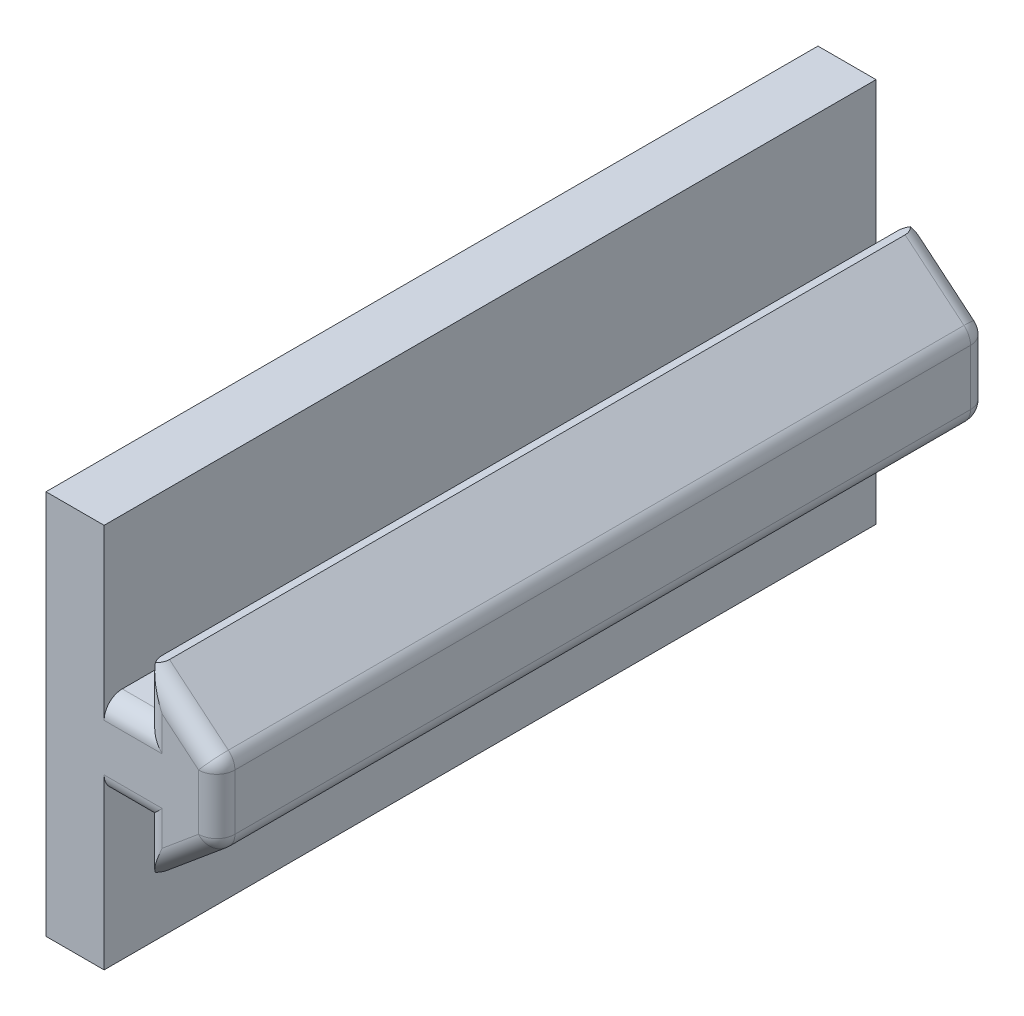
ISO-10303-21;
HEADER;
FILE_DESCRIPTION(('STEP AP214'),'2;1');
FILE_NAME('part.step','',(''),(''),'','','');
FILE_SCHEMA(('AUTOMOTIVE_DESIGN { 1 0 10303 214 1 1 1 1 }'));
ENDSEC;
DATA;
#1=APPLICATION_CONTEXT('core data for automotive mechanical design processes');
#2=APPLICATION_PROTOCOL_DEFINITION('international standard','automotive_design',2000,#1);
#3=PRODUCT_CONTEXT('',#1,'mechanical');
#4=PRODUCT('Part','Part','',(#3));
#5=PRODUCT_RELATED_PRODUCT_CATEGORY('part','',(#4));
#6=PRODUCT_DEFINITION_FORMATION('','',#4);
#7=PRODUCT_DEFINITION_CONTEXT('part definition',#1,'design');
#8=PRODUCT_DEFINITION('design','',#6,#7);
#9=PRODUCT_DEFINITION_SHAPE('','',#8);
#10=(LENGTH_UNIT() NAMED_UNIT(*) SI_UNIT(.MILLI.,.METRE.));
#11=(NAMED_UNIT(*) PLANE_ANGLE_UNIT() SI_UNIT($,.RADIAN.));
#12=(NAMED_UNIT(*) SI_UNIT($,.STERADIAN.) SOLID_ANGLE_UNIT());
#13=UNCERTAINTY_MEASURE_WITH_UNIT(LENGTH_MEASURE(1.E-05),#10,'distance_accuracy_value','');
#14=(GEOMETRIC_REPRESENTATION_CONTEXT(3) GLOBAL_UNCERTAINTY_ASSIGNED_CONTEXT((#13)) GLOBAL_UNIT_ASSIGNED_CONTEXT((#10,
#11,#12)) REPRESENTATION_CONTEXT('',''));
#15=CARTESIAN_POINT('',(0.,0.,0.));
#16=DIRECTION('',(0.,0.,1.));
#17=DIRECTION('',(1.,0.,0.));
#18=AXIS2_PLACEMENT_3D('',#15,#16,#17);
#19=CARTESIAN_POINT('',(7.874,2.54,-26.9875));
#20=DIRECTION('',(0.64018439966448,0.768221279597376,0.));
#21=DIRECTION('',(-0.768221279597376,0.64018439966448,0.));
#22=AXIS2_PLACEMENT_3D('',#19,#20,#21);
#23=PLANE('',#22);
#24=DIRECTION('',(0.,0.,1.));
#25=VECTOR('',#24,1.);
#26=CARTESIAN_POINT('',(3.302,6.35,-26.9875));
#27=LINE('',#26,#25);
#28=CARTESIAN_POINT('',(3.302,6.35,-25.7175));
#29=VERTEX_POINT('',#28);
#30=CARTESIAN_POINT('',(3.302,6.35,25.7175));
#31=VERTEX_POINT('',#30);
#32=EDGE_CURVE('E298',#29,#31,#27,.T.);
#33=ORIENTED_EDGE('',*,*,#32,.T.);
#34=DIRECTION('',(-0.768221279597376,0.64018439966448,0.));
#35=VECTOR('',#34,1.);
#36=CARTESIAN_POINT('',(7.41703418757389,2.92080484368842,25.7175));
#37=LINE('',#36,#35);
#38=CARTESIAN_POINT('',(7.41703418757389,2.92080484368843,25.7175));
#39=VERTEX_POINT('',#38);
#40=EDGE_CURVE('E465',#31,#39,#37,.F.);
#41=ORIENTED_EDGE('',*,*,#40,.T.);
#42=DIRECTION('',(0.,0.,1.));
#43=VECTOR('',#42,1.);
#44=CARTESIAN_POINT('',(7.41703418757389,2.92080484368843,-26.9875));
#45=LINE('',#44,#43);
#46=CARTESIAN_POINT('',(7.41703418757389,2.92080484368843,-25.7175));
#47=VERTEX_POINT('',#46);
#48=EDGE_CURVE('E322',#39,#47,#45,.F.);
#49=ORIENTED_EDGE('',*,*,#48,.T.);
#50=DIRECTION('',(-0.768221279597376,0.64018439966448,0.));
#51=VECTOR('',#50,1.);
#52=CARTESIAN_POINT('',(7.874,2.54,-25.7175));
#53=LINE('',#52,#51);
#54=EDGE_CURVE('E361',#47,#29,#53,.T.);
#55=ORIENTED_EDGE('',*,*,#54,.T.);
#56=EDGE_LOOP('',(#33,#41,#49,#55));
#57=FACE_BOUND('',#56,.T.);
#58=ADVANCED_FACE('F41',(#57),#23,.T.);
#59=CARTESIAN_POINT('',(7.874,-2.54,-26.9875));
#60=DIRECTION('',(1.,0.,0.));
#61=DIRECTION('',(0.,0.,-1.));
#62=AXIS2_PLACEMENT_3D('',#59,#60,#61);
#63=PLANE('',#62);
#64=DIRECTION('',(0.,0.,1.));
#65=VECTOR('',#64,1.);
#66=CARTESIAN_POINT('',(7.874,1.94516381859976,-26.9875));
#67=LINE('',#66,#65);
#68=CARTESIAN_POINT('',(7.874,1.94516381859976,-25.7175));
#69=VERTEX_POINT('',#68);
#70=CARTESIAN_POINT('',(7.874,1.94516381859976,25.7175));
#71=VERTEX_POINT('',#70);
#72=EDGE_CURVE('E315',#69,#71,#67,.T.);
#73=ORIENTED_EDGE('',*,*,#72,.T.);
#74=DIRECTION('',(0.,1.,0.));
#75=VECTOR('',#74,1.);
#76=CARTESIAN_POINT('',(7.874,-1.94516381859976,25.7175));
#77=LINE('',#76,#75);
#78=CARTESIAN_POINT('',(7.874,-1.94516381859976,25.7175));
#79=VERTEX_POINT('',#78);
#80=EDGE_CURVE('E481',#71,#79,#77,.F.);
#81=ORIENTED_EDGE('',*,*,#80,.T.);
#82=DIRECTION('',(0.,0.,1.));
#83=VECTOR('',#82,1.);
#84=CARTESIAN_POINT('',(7.874,-1.94516381859976,-26.9875));
#85=LINE('',#84,#83);
#86=CARTESIAN_POINT('',(7.874,-1.94516381859976,-25.7175));
#87=VERTEX_POINT('',#86);
#88=EDGE_CURVE('E319',#79,#87,#85,.F.);
#89=ORIENTED_EDGE('',*,*,#88,.T.);
#90=DIRECTION('',(0.,1.,0.));
#91=VECTOR('',#90,1.);
#92=CARTESIAN_POINT('',(7.874,-2.54,-25.7175));
#93=LINE('',#92,#91);
#94=EDGE_CURVE('E386',#87,#69,#93,.T.);
#95=ORIENTED_EDGE('',*,*,#94,.T.);
#96=EDGE_LOOP('',(#73,#81,#89,#95));
#97=FACE_BOUND('',#96,.T.);
#98=ADVANCED_FACE('F585',(#97),#63,.T.);
#99=CARTESIAN_POINT('',(3.302,-6.35,-26.9875));
#100=DIRECTION('',(0.64018439966448,-0.768221279597376,0.));
#101=DIRECTION('',(0.768221279597376,0.64018439966448,0.));
#102=AXIS2_PLACEMENT_3D('',#99,#100,#101);
#103=PLANE('',#102);
#104=DIRECTION('',(0.,0.,1.));
#105=VECTOR('',#104,1.);
#106=CARTESIAN_POINT('',(7.41703418757389,-2.92080484368842,-26.9875));
#107=LINE('',#106,#105);
#108=CARTESIAN_POINT('',(7.41703418757389,-2.92080484368842,-25.7175));
#109=VERTEX_POINT('',#108);
#110=CARTESIAN_POINT('',(7.41703418757389,-2.92080484368842,25.7175));
#111=VERTEX_POINT('',#110);
#112=EDGE_CURVE('E311',#109,#111,#107,.T.);
#113=ORIENTED_EDGE('',*,*,#112,.T.);
#114=DIRECTION('',(0.768221279597376,0.64018439966448,0.));
#115=VECTOR('',#114,1.);
#116=CARTESIAN_POINT('',(3.302,-6.35,25.7175));
#117=LINE('',#116,#115);
#118=CARTESIAN_POINT('',(3.302,-6.35,25.7175));
#119=VERTEX_POINT('',#118);
#120=EDGE_CURVE('E447',#111,#119,#117,.F.);
#121=ORIENTED_EDGE('',*,*,#120,.T.);
#122=DIRECTION('',(0.,0.,1.));
#123=VECTOR('',#122,1.);
#124=CARTESIAN_POINT('',(3.302,-6.35,-26.9875));
#125=LINE('',#124,#123);
#126=CARTESIAN_POINT('',(3.302,-6.35,-25.7175));
#127=VERTEX_POINT('',#126);
#128=EDGE_CURVE('E301',#127,#119,#125,.T.);
#129=ORIENTED_EDGE('',*,*,#128,.F.);
#130=DIRECTION('',(0.768221279597376,0.64018439966448,0.));
#131=VECTOR('',#130,1.);
#132=CARTESIAN_POINT('',(3.302,-6.35,-25.7175));
#133=LINE('',#132,#131);
#134=EDGE_CURVE('E325',#127,#109,#133,.T.);
#135=ORIENTED_EDGE('',*,*,#134,.T.);
#136=EDGE_LOOP('',(#113,#121,#129,#135));
#137=FACE_BOUND('',#136,.T.);
#138=ADVANCED_FACE('F640',(#137),#103,.T.);
#139=CARTESIAN_POINT('',(-4.064,-6.35,-26.9875));
#140=DIRECTION('',(0.,-1.,0.));
#141=DIRECTION('',(1.,0.,0.));
#142=AXIS2_PLACEMENT_3D('',#139,#140,#141);
#143=PLANE('',#142);
#144=ORIENTED_EDGE('',*,*,#128,.T.);
#145=CARTESIAN_POINT('',(1.31819658231971,-6.35,25.7175));
#146=DIRECTION('',(0.,-1.,0.));
#147=DIRECTION('',(-1.,0.,0.));
#148=AXIS2_PLACEMENT_3D('',#145,#146,#147);
#149=ELLIPSE('',#148,1.98380341768029,1.27);
#150=CARTESIAN_POINT('',(2.99227872713341,-6.35,26.3989055424527));
#151=VERTEX_POINT('',#150);
#152=EDGE_CURVE('E453',#119,#151,#149,.T.);
#153=ORIENTED_EDGE('',*,*,#152,.T.);
#154=CARTESIAN_POINT('',(4.064,-6.35,25.7175));
#155=DIRECTION('',(0.,-1.,0.));
#156=DIRECTION('',(1.,0.,0.));
#157=AXIS2_PLACEMENT_3D('',#154,#155,#156);
#158=CIRCLE('',#157,1.27);
#159=CARTESIAN_POINT('',(2.794,-6.35,25.7175));
#160=VERTEX_POINT('',#159);
#161=EDGE_CURVE('E450',#151,#160,#158,.T.);
#162=ORIENTED_EDGE('',*,*,#161,.T.);
#163=DIRECTION('',(0.,0.,1.));
#164=VECTOR('',#163,1.);
#165=CARTESIAN_POINT('',(2.794,-6.35,-26.9875));
#166=LINE('',#165,#164);
#167=CARTESIAN_POINT('',(2.794,-6.35,-25.7175));
#168=VERTEX_POINT('',#167);
#169=EDGE_CURVE('E280',#168,#160,#166,.T.);
#170=ORIENTED_EDGE('',*,*,#169,.F.);
#171=CARTESIAN_POINT('',(4.064,-6.35,-25.7175));
#172=DIRECTION('',(0.,-1.,0.));
#173=DIRECTION('',(1.,0.,0.));
#174=AXIS2_PLACEMENT_3D('',#171,#172,#173);
#175=CIRCLE('',#174,1.27);
#176=CARTESIAN_POINT('',(2.99227872713341,-6.35,-26.3989055424527));
#177=VERTEX_POINT('',#176);
#178=EDGE_CURVE('E351',#168,#177,#175,.T.);
#179=ORIENTED_EDGE('',*,*,#178,.T.);
#180=CARTESIAN_POINT('',(1.31819658231971,-6.35,-25.7175));
#181=DIRECTION('',(0.,-1.,0.));
#182=DIRECTION('',(1.,0.,0.));
#183=AXIS2_PLACEMENT_3D('',#180,#181,#182);
#184=ELLIPSE('',#183,1.98380341768029,1.27);
#185=EDGE_CURVE('E354',#177,#127,#184,.T.);
#186=ORIENTED_EDGE('',*,*,#185,.T.);
#187=EDGE_LOOP('',(#144,#153,#162,#170,#179,#186));
#188=FACE_BOUND('',#187,.T.);
#189=ADVANCED_FACE('F621',(#188),#143,.T.);
#190=CARTESIAN_POINT('',(-4.064,6.35,-26.9875));
#191=DIRECTION('',(-1.,0.,0.));
#192=DIRECTION('',(0.,0.,1.));
#193=AXIS2_PLACEMENT_3D('',#190,#191,#192);
#194=PLANE('',#193);
#195=DIRECTION('',(0.,-1.,0.));
#196=VECTOR('',#195,1.);
#197=CARTESIAN_POINT('',(-4.064,6.35,-26.9875));
#198=LINE('',#197,#196);
#199=CARTESIAN_POINT('',(-4.064,13.462,-26.9875));
#200=VERTEX_POINT('',#199);
#201=CARTESIAN_POINT('',(-4.064,-13.462,-26.9875));
#202=VERTEX_POINT('',#201);
#203=EDGE_CURVE('E295',#200,#202,#198,.T.);
#204=ORIENTED_EDGE('',*,*,#203,.T.);
#205=DIRECTION('',(0.,0.,1.));
#206=VECTOR('',#205,1.);
#207=CARTESIAN_POINT('',(-4.064,-13.462,-26.9875));
#208=LINE('',#207,#206);
#209=CARTESIAN_POINT('',(-4.064,-13.462,26.9875));
#210=VERTEX_POINT('',#209);
#211=EDGE_CURVE('E231',#202,#210,#208,.T.);
#212=ORIENTED_EDGE('',*,*,#211,.T.);
#213=DIRECTION('',(0.,-1.,0.));
#214=VECTOR('',#213,1.);
#215=CARTESIAN_POINT('',(-4.064,6.35,26.9875));
#216=LINE('',#215,#214);
#217=CARTESIAN_POINT('',(-4.064,13.462,26.9875));
#218=VERTEX_POINT('',#217);
#219=EDGE_CURVE('E291',#218,#210,#216,.T.);
#220=ORIENTED_EDGE('',*,*,#219,.F.);
#221=DIRECTION('',(0.,0.,-1.));
#222=VECTOR('',#221,1.);
#223=CARTESIAN_POINT('',(-4.064,13.462,-26.9875));
#224=LINE('',#223,#222);
#225=EDGE_CURVE('E239',#218,#200,#224,.T.);
#226=ORIENTED_EDGE('',*,*,#225,.T.);
#227=EDGE_LOOP('',(#204,#212,#220,#226));
#228=FACE_BOUND('',#227,.T.);
#229=ADVANCED_FACE('F545',(#228),#194,.T.);
#230=CARTESIAN_POINT('',(3.302,6.35,-26.9875));
#231=DIRECTION('',(0.,1.,0.));
#232=DIRECTION('',(0.,0.,1.));
#233=AXIS2_PLACEMENT_3D('',#230,#231,#232);
#234=PLANE('',#233);
#235=CARTESIAN_POINT('',(4.064,6.35,25.7175));
#236=DIRECTION('',(0.,1.,0.));
#237=DIRECTION('',(0.,0.,1.));
#238=AXIS2_PLACEMENT_3D('',#235,#236,#237);
#239=CIRCLE('',#238,1.27);
#240=CARTESIAN_POINT('',(2.794,6.35,25.7175));
#241=VERTEX_POINT('',#240);
#242=CARTESIAN_POINT('',(2.99227872713341,6.35,26.3989055424527));
#243=VERTEX_POINT('',#242);
#244=EDGE_CURVE('E459',#241,#243,#239,.T.);
#245=ORIENTED_EDGE('',*,*,#244,.T.);
#246=CARTESIAN_POINT('',(1.31819658231971,6.35,25.7175));
#247=DIRECTION('',(0.,1.,0.));
#248=DIRECTION('',(1.,0.,0.));
#249=AXIS2_PLACEMENT_3D('',#246,#247,#248);
#250=ELLIPSE('',#249,1.98380341768029,1.27);
#251=EDGE_CURVE('E462',#243,#31,#250,.T.);
#252=ORIENTED_EDGE('',*,*,#251,.T.);
#253=ORIENTED_EDGE('',*,*,#32,.F.);
#254=CARTESIAN_POINT('',(1.31819658231971,6.35,-25.7175));
#255=DIRECTION('',(0.,1.,0.));
#256=DIRECTION('',(-1.,0.,0.));
#257=AXIS2_PLACEMENT_3D('',#254,#255,#256);
#258=ELLIPSE('',#257,1.98380341768029,1.27);
#259=CARTESIAN_POINT('',(2.99227872713341,6.35,-26.3989055424527));
#260=VERTEX_POINT('',#259);
#261=EDGE_CURVE('E367',#29,#260,#258,.T.);
#262=ORIENTED_EDGE('',*,*,#261,.T.);
#263=CARTESIAN_POINT('',(4.064,6.35,-25.7175));
#264=DIRECTION('',(0.,1.,0.));
#265=DIRECTION('',(0.,0.,1.));
#266=AXIS2_PLACEMENT_3D('',#263,#264,#265);
#267=CIRCLE('',#266,1.27);
#268=CARTESIAN_POINT('',(2.794,6.35,-25.7175));
#269=VERTEX_POINT('',#268);
#270=EDGE_CURVE('E364',#260,#269,#267,.T.);
#271=ORIENTED_EDGE('',*,*,#270,.T.);
#272=DIRECTION('',(0.,0.,1.));
#273=VECTOR('',#272,1.);
#274=CARTESIAN_POINT('',(2.794,6.35,-26.9875));
#275=LINE('',#274,#273);
#276=EDGE_CURVE('E287',#269,#241,#275,.T.);
#277=ORIENTED_EDGE('',*,*,#276,.T.);
#278=EDGE_LOOP('',(#245,#252,#253,#262,#271,#277));
#279=FACE_BOUND('',#278,.T.);
#280=ADVANCED_FACE('F644',(#279),#234,.T.);
#281=CARTESIAN_POINT('',(0.,0.,-26.9875));
#282=DIRECTION('',(0.,0.,-1.));
#283=DIRECTION('',(-1.,0.,0.));
#284=AXIS2_PLACEMENT_3D('',#281,#282,#283);
#285=PLANE('',#284);
#286=DIRECTION('',(-1.,0.,0.));
#287=VECTOR('',#286,1.);
#288=CARTESIAN_POINT('',(0.,-1.651,-26.9875));
#289=LINE('',#288,#287);
#290=CARTESIAN_POINT('',(4.064,-1.651,-26.9875));
#291=VERTEX_POINT('',#290);
#292=CARTESIAN_POINT('',(0.,-1.651,-26.9875));
#293=VERTEX_POINT('',#292);
#294=EDGE_CURVE('E347',#291,#293,#289,.T.);
#295=ORIENTED_EDGE('',*,*,#294,.T.);
#296=DIRECTION('',(0.,-1.,0.));
#297=VECTOR('',#296,1.);
#298=CARTESIAN_POINT('',(0.,-13.462,-26.9875));
#299=LINE('',#298,#297);
#300=CARTESIAN_POINT('',(0.,-13.462,-26.9875));
#301=VERTEX_POINT('',#300);
#302=EDGE_CURVE('E250',#293,#301,#299,.T.);
#303=ORIENTED_EDGE('',*,*,#302,.T.);
#304=DIRECTION('',(-1.,0.,0.));
#305=VECTOR('',#304,1.);
#306=CARTESIAN_POINT('',(0.,-13.462,-26.9875));
#307=LINE('',#306,#305);
#308=EDGE_CURVE('E271',#301,#202,#307,.T.);
#309=ORIENTED_EDGE('',*,*,#308,.T.);
#310=ORIENTED_EDGE('',*,*,#203,.F.);
#311=DIRECTION('',(-1.,0.,0.));
#312=VECTOR('',#311,1.);
#313=CARTESIAN_POINT('',(0.,13.462,-26.9875));
#314=LINE('',#313,#312);
#315=CARTESIAN_POINT('',(0.,13.462,-26.9875));
#316=VERTEX_POINT('',#315);
#317=EDGE_CURVE('E241',#316,#200,#314,.T.);
#318=ORIENTED_EDGE('',*,*,#317,.F.);
#319=CARTESIAN_POINT('',(0.,1.651,-26.9875));
#320=VERTEX_POINT('',#319);
#321=EDGE_CURVE('E248',#316,#320,#299,.T.);
#322=ORIENTED_EDGE('',*,*,#321,.T.);
#323=DIRECTION('',(1.,0.,0.));
#324=VECTOR('',#323,1.);
#325=CARTESIAN_POINT('',(2.794,1.651,-26.9875));
#326=LINE('',#325,#324);
#327=CARTESIAN_POINT('',(4.064,1.651,-26.9875));
#328=VERTEX_POINT('',#327);
#329=EDGE_CURVE('E344',#320,#328,#326,.T.);
#330=ORIENTED_EDGE('',*,*,#329,.T.);
#331=DIRECTION('',(0.,1.,0.));
#332=VECTOR('',#331,1.);
#333=CARTESIAN_POINT('',(4.064,6.35,-26.9875));
#334=LINE('',#333,#332);
#335=CARTESIAN_POINT('',(4.064,4.06183048526643,-26.9875));
#336=VERTEX_POINT('',#335);
#337=EDGE_CURVE('E341',#328,#336,#334,.T.);
#338=ORIENTED_EDGE('',*,*,#337,.T.);
#339=DIRECTION('',(-0.768221279597376,0.64018439966448,0.));
#340=VECTOR('',#339,1.);
#341=CARTESIAN_POINT('',(3.66319532062283,4.3958343847474,-26.9875));
#342=LINE('',#341,#340);
#343=CARTESIAN_POINT('',(6.604,1.94516381859976,-26.9875));
#344=VERTEX_POINT('',#343);
#345=EDGE_CURVE('E332',#336,#344,#342,.F.);
#346=ORIENTED_EDGE('',*,*,#345,.T.);
#347=DIRECTION('',(0.,1.,0.));
#348=VECTOR('',#347,1.);
#349=CARTESIAN_POINT('',(6.604,0.,-26.9875));
#350=LINE('',#349,#348);
#351=CARTESIAN_POINT('',(6.604,-1.94516381859976,-26.9875));
#352=VERTEX_POINT('',#351);
#353=EDGE_CURVE('E329',#344,#352,#350,.F.);
#354=ORIENTED_EDGE('',*,*,#353,.T.);
#355=DIRECTION('',(0.768221279597376,0.64018439966448,0.));
#356=VECTOR('',#355,1.);
#357=CARTESIAN_POINT('',(3.66319532062283,-4.3958343847474,-26.9875));
#358=LINE('',#357,#356);
#359=CARTESIAN_POINT('',(4.064,-4.06183048526642,-26.9875));
#360=VERTEX_POINT('',#359);
#361=EDGE_CURVE('E335',#352,#360,#358,.F.);
#362=ORIENTED_EDGE('',*,*,#361,.T.);
#363=DIRECTION('',(0.,1.,0.));
#364=VECTOR('',#363,1.);
#365=CARTESIAN_POINT('',(4.064,-2.921,-26.9875));
#366=LINE('',#365,#364);
#367=EDGE_CURVE('E338',#360,#291,#366,.T.);
#368=ORIENTED_EDGE('',*,*,#367,.T.);
#369=EDGE_LOOP('',(#295,#303,#309,#310,#318,#322,#330,#338,#346,#354,#362,#368));
#370=FACE_BOUND('',#369,.T.);
#371=ADVANCED_FACE('F542',(#370),#285,.T.);
#372=CARTESIAN_POINT('',(0.,0.,26.9875));
#373=DIRECTION('',(0.,0.,-1.));
#374=DIRECTION('',(-1.,0.,0.));
#375=AXIS2_PLACEMENT_3D('',#372,#373,#374);
#376=PLANE('',#375);
#377=DIRECTION('',(1.,0.,0.));
#378=VECTOR('',#377,1.);
#379=CARTESIAN_POINT('',(0.,1.651,26.9875));
#380=LINE('',#379,#378);
#381=CARTESIAN_POINT('',(4.064,1.651,26.9875));
#382=VERTEX_POINT('',#381);
#383=CARTESIAN_POINT('',(0.,1.651,26.9875));
#384=VERTEX_POINT('',#383);
#385=EDGE_CURVE('E225',#382,#384,#380,.F.);
#386=ORIENTED_EDGE('',*,*,#385,.T.);
#387=DIRECTION('',(0.,1.,0.));
#388=VECTOR('',#387,1.);
#389=CARTESIAN_POINT('',(0.,-13.462,26.9875));
#390=LINE('',#389,#388);
#391=CARTESIAN_POINT('',(0.,13.462,26.9875));
#392=VERTEX_POINT('',#391);
#393=EDGE_CURVE('E219',#384,#392,#390,.T.);
#394=ORIENTED_EDGE('',*,*,#393,.T.);
#395=DIRECTION('',(-1.,0.,0.));
#396=VECTOR('',#395,1.);
#397=CARTESIAN_POINT('',(0.,13.462,26.9875));
#398=LINE('',#397,#396);
#399=EDGE_CURVE('E222',#392,#218,#398,.T.);
#400=ORIENTED_EDGE('',*,*,#399,.T.);
#401=ORIENTED_EDGE('',*,*,#219,.T.);
#402=DIRECTION('',(-1.,0.,0.));
#403=VECTOR('',#402,1.);
#404=CARTESIAN_POINT('',(0.,-13.462,26.9875));
#405=LINE('',#404,#403);
#406=CARTESIAN_POINT('',(0.,-13.462,26.9875));
#407=VERTEX_POINT('',#406);
#408=EDGE_CURVE('E266',#407,#210,#405,.T.);
#409=ORIENTED_EDGE('',*,*,#408,.F.);
#410=CARTESIAN_POINT('',(0.,-1.651,26.9875));
#411=VERTEX_POINT('',#410);
#412=EDGE_CURVE('E230',#407,#411,#390,.T.);
#413=ORIENTED_EDGE('',*,*,#412,.T.);
#414=DIRECTION('',(-1.,0.,0.));
#415=VECTOR('',#414,1.);
#416=CARTESIAN_POINT('',(0.,-1.651,26.9875));
#417=LINE('',#416,#415);
#418=CARTESIAN_POINT('',(4.064,-1.651,26.9875));
#419=VERTEX_POINT('',#418);
#420=EDGE_CURVE('E439',#411,#419,#417,.F.);
#421=ORIENTED_EDGE('',*,*,#420,.T.);
#422=DIRECTION('',(0.,1.,0.));
#423=VECTOR('',#422,1.);
#424=CARTESIAN_POINT('',(4.064,0.,26.9875));
#425=LINE('',#424,#423);
#426=CARTESIAN_POINT('',(4.064,-4.06183048526642,26.9875));
#427=VERTEX_POINT('',#426);
#428=EDGE_CURVE('E436',#419,#427,#425,.F.);
#429=ORIENTED_EDGE('',*,*,#428,.T.);
#430=DIRECTION('',(0.768221279597376,0.64018439966448,0.));
#431=VECTOR('',#430,1.);
#432=CARTESIAN_POINT('',(6.604,-1.94516381859976,26.9875));
#433=LINE('',#432,#431);
#434=CARTESIAN_POINT('',(6.604,-1.94516381859976,26.9875));
#435=VERTEX_POINT('',#434);
#436=EDGE_CURVE('E432',#427,#435,#433,.T.);
#437=ORIENTED_EDGE('',*,*,#436,.T.);
#438=DIRECTION('',(0.,1.,0.));
#439=VECTOR('',#438,1.);
#440=CARTESIAN_POINT('',(6.604,1.94516381859976,26.9875));
#441=LINE('',#440,#439);
#442=CARTESIAN_POINT('',(6.604,1.94516381859976,26.9875));
#443=VERTEX_POINT('',#442);
#444=EDGE_CURVE('E396',#435,#443,#441,.T.);
#445=ORIENTED_EDGE('',*,*,#444,.T.);
#446=DIRECTION('',(-0.768221279597376,0.64018439966448,0.));
#447=VECTOR('',#446,1.);
#448=CARTESIAN_POINT('',(2.48896581242611,5.37435897491133,26.9875));
#449=LINE('',#448,#447);
#450=CARTESIAN_POINT('',(4.064,4.06183048526642,26.9875));
#451=VERTEX_POINT('',#450);
#452=EDGE_CURVE('E429',#443,#451,#449,.T.);
#453=ORIENTED_EDGE('',*,*,#452,.T.);
#454=DIRECTION('',(0.,1.,0.));
#455=VECTOR('',#454,1.);
#456=CARTESIAN_POINT('',(4.064,0.,26.9875));
#457=LINE('',#456,#455);
#458=EDGE_CURVE('E442',#451,#382,#457,.F.);
#459=ORIENTED_EDGE('',*,*,#458,.T.);
#460=EDGE_LOOP('',(#386,#394,#400,#401,#409,#413,#421,#429,#437,#445,#453,#459));
#461=FACE_BOUND('',#460,.T.);
#462=ADVANCED_FACE('F221',(#461),#376,.F.);
#463=CARTESIAN_POINT('',(2.794,2.921,-26.9875));
#464=DIRECTION('',(1.,0.,0.));
#465=DIRECTION('',(0.,0.,-1.));
#466=AXIS2_PLACEMENT_3D('',#463,#464,#465);
#467=PLANE('',#466);
#468=DIRECTION('',(0.,0.,1.));
#469=VECTOR('',#468,1.);
#470=CARTESIAN_POINT('',(2.794,2.921,-26.9875));
#471=LINE('',#470,#469);
#472=CARTESIAN_POINT('',(2.794,2.921,-25.7175));
#473=VERTEX_POINT('',#472);
#474=CARTESIAN_POINT('',(2.794,2.921,25.7175));
#475=VERTEX_POINT('',#474);
#476=EDGE_CURVE('E284',#473,#475,#471,.T.);
#477=ORIENTED_EDGE('',*,*,#476,.T.);
#478=DIRECTION('',(0.,1.,0.));
#479=VECTOR('',#478,1.);
#480=CARTESIAN_POINT('',(2.794,2.921,25.7175));
#481=LINE('',#480,#479);
#482=EDGE_CURVE('E471',#475,#241,#481,.T.);
#483=ORIENTED_EDGE('',*,*,#482,.T.);
#484=ORIENTED_EDGE('',*,*,#276,.F.);
#485=DIRECTION('',(0.,1.,0.));
#486=VECTOR('',#485,1.);
#487=CARTESIAN_POINT('',(2.794,2.921,-25.7175));
#488=LINE('',#487,#486);
#489=EDGE_CURVE('E380',#269,#473,#488,.F.);
#490=ORIENTED_EDGE('',*,*,#489,.T.);
#491=EDGE_LOOP('',(#477,#483,#484,#490));
#492=FACE_BOUND('',#491,.T.);
#493=ADVANCED_FACE('F856',(#492),#467,.F.);
#494=CARTESIAN_POINT('',(-4.064,2.921,-26.9875));
#495=DIRECTION('',(0.,-1.,0.));
#496=DIRECTION('',(0.,0.,-1.));
#497=AXIS2_PLACEMENT_3D('',#494,#495,#496);
#498=PLANE('',#497);
#499=DIRECTION('',(0.,0.,1.));
#500=VECTOR('',#499,1.);
#501=CARTESIAN_POINT('',(0.,2.921,-26.9875));
#502=LINE('',#501,#500);
#503=CARTESIAN_POINT('',(0.,2.921,-25.7175));
#504=VERTEX_POINT('',#503);
#505=CARTESIAN_POINT('',(0.,2.921,25.7175));
#506=VERTEX_POINT('',#505);
#507=EDGE_CURVE('E270',#504,#506,#502,.T.);
#508=ORIENTED_EDGE('',*,*,#507,.T.);
#509=DIRECTION('',(1.,0.,0.));
#510=VECTOR('',#509,1.);
#511=CARTESIAN_POINT('',(-4.064,2.921,25.7175));
#512=LINE('',#511,#510);
#513=EDGE_CURVE('E474',#506,#475,#512,.T.);
#514=ORIENTED_EDGE('',*,*,#513,.T.);
#515=ORIENTED_EDGE('',*,*,#476,.F.);
#516=DIRECTION('',(1.,0.,0.));
#517=VECTOR('',#516,1.);
#518=CARTESIAN_POINT('',(0.,2.921,-25.7175));
#519=LINE('',#518,#517);
#520=EDGE_CURVE('E377',#473,#504,#519,.F.);
#521=ORIENTED_EDGE('',*,*,#520,.T.);
#522=EDGE_LOOP('',(#508,#514,#515,#521));
#523=FACE_BOUND('',#522,.T.);
#524=ADVANCED_FACE('F527',(#523),#498,.F.);
#525=CARTESIAN_POINT('',(2.794,-2.921,-26.9875));
#526=DIRECTION('',(0.,1.,0.));
#527=DIRECTION('',(-1.,0.,0.));
#528=AXIS2_PLACEMENT_3D('',#525,#526,#527);
#529=PLANE('',#528);
#530=DIRECTION('',(0.,0.,1.));
#531=VECTOR('',#530,1.);
#532=CARTESIAN_POINT('',(2.794,-2.921,-26.9875));
#533=LINE('',#532,#531);
#534=CARTESIAN_POINT('',(2.794,-2.921,-25.7175));
#535=VERTEX_POINT('',#534);
#536=CARTESIAN_POINT('',(2.794,-2.921,25.7175));
#537=VERTEX_POINT('',#536);
#538=EDGE_CURVE('E281',#535,#537,#533,.T.);
#539=ORIENTED_EDGE('',*,*,#538,.T.);
#540=DIRECTION('',(-1.,0.,0.));
#541=VECTOR('',#540,1.);
#542=CARTESIAN_POINT('',(2.794,-2.921,25.7175));
#543=LINE('',#542,#541);
#544=CARTESIAN_POINT('',(0.,-2.921,25.7175));
#545=VERTEX_POINT('',#544);
#546=EDGE_CURVE('E66',#537,#545,#543,.T.);
#547=ORIENTED_EDGE('',*,*,#546,.T.);
#548=DIRECTION('',(0.,0.,-1.));
#549=VECTOR('',#548,1.);
#550=CARTESIAN_POINT('',(0.,-2.921,-26.9875));
#551=LINE('',#550,#549);
#552=CARTESIAN_POINT('',(0.,-2.921,-25.7175));
#553=VERTEX_POINT('',#552);
#554=EDGE_CURVE('E305',#545,#553,#551,.T.);
#555=ORIENTED_EDGE('',*,*,#554,.T.);
#556=DIRECTION('',(-1.,0.,0.));
#557=VECTOR('',#556,1.);
#558=CARTESIAN_POINT('',(2.794,-2.921,-25.7175));
#559=LINE('',#558,#557);
#560=EDGE_CURVE('E374',#553,#535,#559,.F.);
#561=ORIENTED_EDGE('',*,*,#560,.T.);
#562=EDGE_LOOP('',(#539,#547,#555,#561));
#563=FACE_BOUND('',#562,.T.);
#564=ADVANCED_FACE('F617',(#563),#529,.F.);
#565=CARTESIAN_POINT('',(2.794,-6.35,-26.9875));
#566=DIRECTION('',(1.,0.,0.));
#567=DIRECTION('',(0.,0.,-1.));
#568=AXIS2_PLACEMENT_3D('',#565,#566,#567);
#569=PLANE('',#568);
#570=ORIENTED_EDGE('',*,*,#169,.T.);
#571=DIRECTION('',(0.,1.,0.));
#572=VECTOR('',#571,1.);
#573=CARTESIAN_POINT('',(2.794,-6.35,25.7175));
#574=LINE('',#573,#572);
#575=EDGE_CURVE('E59',#160,#537,#574,.T.);
#576=ORIENTED_EDGE('',*,*,#575,.T.);
#577=ORIENTED_EDGE('',*,*,#538,.F.);
#578=DIRECTION('',(0.,1.,0.));
#579=VECTOR('',#578,1.);
#580=CARTESIAN_POINT('',(2.794,-6.35,-25.7175));
#581=LINE('',#580,#579);
#582=EDGE_CURVE('E383',#535,#168,#581,.F.);
#583=ORIENTED_EDGE('',*,*,#582,.T.);
#584=EDGE_LOOP('',(#570,#576,#577,#583));
#585=FACE_BOUND('',#584,.T.);
#586=ADVANCED_FACE('F618',(#585),#569,.F.);
#587=CARTESIAN_POINT('',(0.,-13.462,-26.9875));
#588=DIRECTION('',(0.,-1.,0.));
#589=DIRECTION('',(0.,0.,-1.));
#590=AXIS2_PLACEMENT_3D('',#587,#588,#589);
#591=PLANE('',#590);
#592=ORIENTED_EDGE('',*,*,#211,.F.);
#593=ORIENTED_EDGE('',*,*,#308,.F.);
#594=DIRECTION('',(0.,0.,1.));
#595=VECTOR('',#594,1.);
#596=CARTESIAN_POINT('',(0.,-13.462,-26.9875));
#597=LINE('',#596,#595);
#598=EDGE_CURVE('E242',#301,#407,#597,.T.);
#599=ORIENTED_EDGE('',*,*,#598,.T.);
#600=ORIENTED_EDGE('',*,*,#408,.T.);
#601=EDGE_LOOP('',(#592,#593,#599,#600));
#602=FACE_BOUND('',#601,.T.);
#603=ADVANCED_FACE('F549',(#602),#591,.T.);
#604=CARTESIAN_POINT('',(0.,0.,0.));
#605=DIRECTION('',(1.,0.,0.));
#606=DIRECTION('',(0.,0.,-1.));
#607=AXIS2_PLACEMENT_3D('',#604,#605,#606);
#608=PLANE('',#607);
#609=ORIENTED_EDGE('',*,*,#554,.F.);
#610=CARTESIAN_POINT('',(0.,-1.651,25.7175));
#611=DIRECTION('',(1.,0.,0.));
#612=DIRECTION('',(0.,0.,-1.));
#613=AXIS2_PLACEMENT_3D('',#610,#611,#612);
#614=CIRCLE('',#613,1.27);
#615=EDGE_CURVE('E11',#545,#411,#614,.F.);
#616=ORIENTED_EDGE('',*,*,#615,.T.);
#617=ORIENTED_EDGE('',*,*,#412,.F.);
#618=ORIENTED_EDGE('',*,*,#598,.F.);
#619=ORIENTED_EDGE('',*,*,#302,.F.);
#620=CARTESIAN_POINT('',(0.,-1.651,-25.7175));
#621=DIRECTION('',(1.,0.,0.));
#622=DIRECTION('',(0.,0.,-1.));
#623=AXIS2_PLACEMENT_3D('',#620,#621,#622);
#624=CIRCLE('',#623,1.27);
#625=EDGE_CURVE('E389',#293,#553,#624,.F.);
#626=ORIENTED_EDGE('',*,*,#625,.T.);
#627=EDGE_LOOP('',(#609,#616,#617,#618,#619,#626));
#628=FACE_BOUND('',#627,.T.);
#629=ADVANCED_FACE('F553',(#628),#608,.T.);
#630=ORIENTED_EDGE('',*,*,#507,.F.);
#631=CARTESIAN_POINT('',(0.,1.651,-25.7175));
#632=DIRECTION('',(1.,0.,0.));
#633=DIRECTION('',(0.,0.,-1.));
#634=AXIS2_PLACEMENT_3D('',#631,#632,#633);
#635=CIRCLE('',#634,1.27);
#636=EDGE_CURVE('E393',#504,#320,#635,.F.);
#637=ORIENTED_EDGE('',*,*,#636,.T.);
#638=ORIENTED_EDGE('',*,*,#321,.F.);
#639=DIRECTION('',(0.,0.,-1.));
#640=VECTOR('',#639,1.);
#641=CARTESIAN_POINT('',(0.,13.462,-26.9875));
#642=LINE('',#641,#640);
#643=EDGE_CURVE('E237',#392,#316,#642,.T.);
#644=ORIENTED_EDGE('',*,*,#643,.F.);
#645=ORIENTED_EDGE('',*,*,#393,.F.);
#646=CARTESIAN_POINT('',(0.,1.651,25.7175));
#647=DIRECTION('',(1.,0.,0.));
#648=DIRECTION('',(0.,0.,-1.));
#649=AXIS2_PLACEMENT_3D('',#646,#647,#648);
#650=CIRCLE('',#649,1.27);
#651=EDGE_CURVE('E51',#384,#506,#650,.F.);
#652=ORIENTED_EDGE('',*,*,#651,.T.);
#653=EDGE_LOOP('',(#630,#637,#638,#644,#645,#652));
#654=FACE_BOUND('',#653,.T.);
#655=ADVANCED_FACE('F246',(#654),#608,.T.);
#656=CARTESIAN_POINT('',(0.,13.462,-26.9875));
#657=DIRECTION('',(0.,1.,0.));
#658=DIRECTION('',(0.,0.,1.));
#659=AXIS2_PLACEMENT_3D('',#656,#657,#658);
#660=PLANE('',#659);
#661=ORIENTED_EDGE('',*,*,#225,.F.);
#662=ORIENTED_EDGE('',*,*,#399,.F.);
#663=ORIENTED_EDGE('',*,*,#643,.T.);
#664=ORIENTED_EDGE('',*,*,#317,.T.);
#665=EDGE_LOOP('',(#661,#662,#663,#664));
#666=FACE_BOUND('',#665,.T.);
#667=ADVANCED_FACE('F235',(#666),#660,.T.);
#668=CARTESIAN_POINT('',(6.604,-1.94516381859976,-26.9875));
#669=DIRECTION('',(0.,0.,1.));
#670=DIRECTION('',(1.,0.,0.));
#671=AXIS2_PLACEMENT_3D('',#668,#669,#670);
#672=CYLINDRICAL_SURFACE('',#671,1.27);
#673=ORIENTED_EDGE('',*,*,#88,.F.);
#674=CARTESIAN_POINT('',(6.604,-1.94516381859976,25.7175));
#675=DIRECTION('',(0.,0.,1.));
#676=DIRECTION('',(1.,0.,0.));
#677=AXIS2_PLACEMENT_3D('',#674,#675,#676);
#678=CIRCLE('',#677,1.27);
#679=EDGE_CURVE('E456',#79,#111,#678,.F.);
#680=ORIENTED_EDGE('',*,*,#679,.T.);
#681=ORIENTED_EDGE('',*,*,#112,.F.);
#682=CARTESIAN_POINT('',(6.604,-1.94516381859976,-25.7175));
#683=DIRECTION('',(0.,0.,1.));
#684=DIRECTION('',(1.,0.,0.));
#685=AXIS2_PLACEMENT_3D('',#682,#683,#684);
#686=CIRCLE('',#685,1.27);
#687=EDGE_CURVE('E357',#109,#87,#686,.T.);
#688=ORIENTED_EDGE('',*,*,#687,.T.);
#689=EDGE_LOOP('',(#673,#680,#681,#688));
#690=FACE_BOUND('',#689,.T.);
#691=ADVANCED_FACE('F588',(#690),#672,.T.);
#692=CARTESIAN_POINT('',(6.604,1.94516381859976,-26.9875));
#693=DIRECTION('',(0.,0.,1.));
#694=DIRECTION('',(1.,0.,0.));
#695=AXIS2_PLACEMENT_3D('',#692,#693,#694);
#696=CYLINDRICAL_SURFACE('',#695,1.27);
#697=ORIENTED_EDGE('',*,*,#48,.F.);
#698=CARTESIAN_POINT('',(6.604,1.94516381859976,25.7175));
#699=DIRECTION('',(0.,0.,1.));
#700=DIRECTION('',(1.,0.,0.));
#701=AXIS2_PLACEMENT_3D('',#698,#699,#700);
#702=CIRCLE('',#701,1.27);
#703=EDGE_CURVE('E468',#39,#71,#702,.F.);
#704=ORIENTED_EDGE('',*,*,#703,.T.);
#705=ORIENTED_EDGE('',*,*,#72,.F.);
#706=CARTESIAN_POINT('',(6.604,1.94516381859976,-25.7175));
#707=DIRECTION('',(0.,0.,1.));
#708=DIRECTION('',(1.,0.,0.));
#709=AXIS2_PLACEMENT_3D('',#706,#707,#708);
#710=CIRCLE('',#709,1.27);
#711=EDGE_CURVE('E370',#69,#47,#710,.T.);
#712=ORIENTED_EDGE('',*,*,#711,.T.);
#713=EDGE_LOOP('',(#697,#704,#705,#712));
#714=FACE_BOUND('',#713,.T.);
#715=ADVANCED_FACE('F648',(#714),#696,.T.);
#716=CARTESIAN_POINT('',(0.,1.651,-25.7175));
#717=DIRECTION('',(-1.,0.,0.));
#718=DIRECTION('',(0.,0.,1.));
#719=AXIS2_PLACEMENT_3D('',#716,#717,#718);
#720=CYLINDRICAL_SURFACE('',#719,1.27);
#721=ORIENTED_EDGE('',*,*,#636,.F.);
#722=ORIENTED_EDGE('',*,*,#520,.F.);
#723=CARTESIAN_POINT('',(4.064,1.651,-25.7175));
#724=DIRECTION('',(-0.707106781186547,-0.707106781186547,0.));
#725=DIRECTION('',(-0.707106781186547,0.707106781186547,0.));
#726=AXIS2_PLACEMENT_3D('',#723,#724,#725);
#727=ELLIPSE('',#726,1.79605122421383,1.27);
#728=EDGE_CURVE('E262',#328,#473,#727,.F.);
#729=ORIENTED_EDGE('',*,*,#728,.F.);
#730=ORIENTED_EDGE('',*,*,#329,.F.);
#731=EDGE_LOOP('',(#721,#722,#729,#730));
#732=FACE_BOUND('',#731,.T.);
#733=ADVANCED_FACE('F532',(#732),#720,.T.);
#734=CARTESIAN_POINT('',(4.064,0.,-25.7175));
#735=DIRECTION('',(0.,-1.,0.));
#736=DIRECTION('',(0.,0.,-1.));
#737=AXIS2_PLACEMENT_3D('',#734,#735,#736);
#738=CYLINDRICAL_SURFACE('',#737,1.27);
#739=ORIENTED_EDGE('',*,*,#489,.F.);
#740=ORIENTED_EDGE('',*,*,#270,.F.);
#741=CARTESIAN_POINT('',(4.064,4.06183048526642,-25.7175));
#742=DIRECTION('',(-0.90558942122368,-0.424155396249723,0.));
#743=DIRECTION('',(-0.424155396249724,0.90558942122368,0.));
#744=AXIS2_PLACEMENT_3D('',#741,#742,#743);
#745=ELLIPSE('',#744,2.99418564806442,1.27);
#746=EDGE_CURVE('E420',#336,#260,#745,.F.);
#747=ORIENTED_EDGE('',*,*,#746,.F.);
#748=ORIENTED_EDGE('',*,*,#337,.F.);
#749=ORIENTED_EDGE('',*,*,#728,.T.);
#750=EDGE_LOOP('',(#739,#740,#747,#748,#749));
#751=FACE_BOUND('',#750,.T.);
#752=ADVANCED_FACE('F537',(#751),#738,.T.);
#753=CARTESIAN_POINT('',(7.06096581242611,1.56435897491133,-25.7175));
#754=DIRECTION('',(-0.768221279597376,0.64018439966448,0.));
#755=DIRECTION('',(-0.64018439966448,-0.768221279597376,0.));
#756=AXIS2_PLACEMENT_3D('',#753,#754,#755);
#757=CYLINDRICAL_SURFACE('',#756,1.27);
#758=ORIENTED_EDGE('',*,*,#261,.F.);
#759=ORIENTED_EDGE('',*,*,#54,.F.);
#760=CARTESIAN_POINT('',(6.604,1.94516381859976,-25.7175));
#761=DIRECTION('',(0.768221279597376,-0.64018439966448,0.));
#762=DIRECTION('',(0.64018439966448,0.768221279597376,0.));
#763=AXIS2_PLACEMENT_3D('',#760,#761,#762);
#764=CIRCLE('',#763,1.27);
#765=EDGE_CURVE('E416',#344,#47,#764,.T.);
#766=ORIENTED_EDGE('',*,*,#765,.F.);
#767=ORIENTED_EDGE('',*,*,#345,.F.);
#768=ORIENTED_EDGE('',*,*,#746,.T.);
#769=EDGE_LOOP('',(#758,#759,#766,#767,#768));
#770=FACE_BOUND('',#769,.T.);
#771=ADVANCED_FACE('F665',(#770),#757,.T.);
#772=CARTESIAN_POINT('',(6.604,1.94516381859976,-25.7175));
#773=DIRECTION('',(0.,0.,-1.));
#774=DIRECTION('',(-1.,0.,0.));
#775=AXIS2_PLACEMENT_3D('',#772,#773,#774);
#776=SPHERICAL_SURFACE('',#775,1.27);
#777=ORIENTED_EDGE('',*,*,#765,.T.);
#778=ORIENTED_EDGE('',*,*,#711,.F.);
#779=CARTESIAN_POINT('',(6.604,1.94516381859976,-25.7175));
#780=DIRECTION('',(0.,-1.,0.));
#781=DIRECTION('',(0.,0.,-1.));
#782=AXIS2_PLACEMENT_3D('',#779,#780,#781);
#783=CIRCLE('',#782,1.27);
#784=EDGE_CURVE('E412',#344,#69,#783,.T.);
#785=ORIENTED_EDGE('',*,*,#784,.F.);
#786=EDGE_LOOP('',(#777,#778,#785));
#787=FACE_BOUND('',#786,.T.);
#788=ADVANCED_FACE('F662',(#787),#776,.T.);
#789=CARTESIAN_POINT('',(0.,-1.651,-25.7175));
#790=DIRECTION('',(1.,0.,0.));
#791=DIRECTION('',(0.,1.,0.));
#792=AXIS2_PLACEMENT_3D('',#789,#790,#791);
#793=CYLINDRICAL_SURFACE('',#792,1.27);
#794=ORIENTED_EDGE('',*,*,#625,.F.);
#795=ORIENTED_EDGE('',*,*,#294,.F.);
#796=CARTESIAN_POINT('',(4.064,-1.651,-25.7175));
#797=DIRECTION('',(0.707106781186548,-0.707106781186547,0.));
#798=DIRECTION('',(0.707106781186547,0.707106781186548,0.));
#799=AXIS2_PLACEMENT_3D('',#796,#797,#798);
#800=ELLIPSE('',#799,1.79605122421383,1.27);
#801=EDGE_CURVE('E408',#535,#291,#800,.T.);
#802=ORIENTED_EDGE('',*,*,#801,.F.);
#803=ORIENTED_EDGE('',*,*,#560,.F.);
#804=EDGE_LOOP('',(#794,#795,#802,#803));
#805=FACE_BOUND('',#804,.T.);
#806=ADVANCED_FACE('F616',(#805),#793,.T.);
#807=CARTESIAN_POINT('',(6.604,-2.54,-25.7175));
#808=DIRECTION('',(0.,1.,0.));
#809=DIRECTION('',(0.,0.,1.));
#810=AXIS2_PLACEMENT_3D('',#807,#808,#809);
#811=CYLINDRICAL_SURFACE('',#810,1.27);
#812=ORIENTED_EDGE('',*,*,#784,.T.);
#813=ORIENTED_EDGE('',*,*,#94,.F.);
#814=CARTESIAN_POINT('',(6.604,-1.94516381859976,-25.7175));
#815=DIRECTION('',(0.,-1.,0.));
#816=DIRECTION('',(0.,0.,-1.));
#817=AXIS2_PLACEMENT_3D('',#814,#815,#816);
#818=CIRCLE('',#817,1.27);
#819=EDGE_CURVE('E404',#352,#87,#818,.T.);
#820=ORIENTED_EDGE('',*,*,#819,.F.);
#821=ORIENTED_EDGE('',*,*,#353,.F.);
#822=EDGE_LOOP('',(#812,#813,#820,#821));
#823=FACE_BOUND('',#822,.T.);
#824=ADVANCED_FACE('F596',(#823),#811,.T.);
#825=CARTESIAN_POINT('',(4.064,0.,-25.7175));
#826=DIRECTION('',(0.,-1.,0.));
#827=DIRECTION('',(0.,0.,-1.));
#828=AXIS2_PLACEMENT_3D('',#825,#826,#827);
#829=CYLINDRICAL_SURFACE('',#828,1.27);
#830=ORIENTED_EDGE('',*,*,#801,.T.);
#831=ORIENTED_EDGE('',*,*,#367,.F.);
#832=CARTESIAN_POINT('',(4.064,-4.06183048526642,-25.7175));
#833=DIRECTION('',(0.90558942122368,-0.424155396249723,0.));
#834=DIRECTION('',(-0.424155396249724,-0.90558942122368,0.));
#835=AXIS2_PLACEMENT_3D('',#832,#833,#834);
#836=ELLIPSE('',#835,2.99418564806442,1.27);
#837=EDGE_CURVE('E400',#177,#360,#836,.T.);
#838=ORIENTED_EDGE('',*,*,#837,.F.);
#839=ORIENTED_EDGE('',*,*,#178,.F.);
#840=ORIENTED_EDGE('',*,*,#582,.F.);
#841=EDGE_LOOP('',(#830,#831,#838,#839,#840));
#842=FACE_BOUND('',#841,.T.);
#843=ADVANCED_FACE('F609',(#842),#829,.T.);
#844=CARTESIAN_POINT('',(6.604,-1.94516381859976,-25.7175));
#845=DIRECTION('',(0.,0.,-1.));
#846=DIRECTION('',(-1.,0.,0.));
#847=AXIS2_PLACEMENT_3D('',#844,#845,#846);
#848=SPHERICAL_SURFACE('',#847,1.27);
#849=ORIENTED_EDGE('',*,*,#819,.T.);
#850=ORIENTED_EDGE('',*,*,#687,.F.);
#851=CARTESIAN_POINT('',(6.604,-1.94516381859976,-25.7175));
#852=DIRECTION('',(-0.768221279597375,-0.64018439966448,0.));
#853=DIRECTION('',(0.64018439966448,-0.768221279597375,0.));
#854=AXIS2_PLACEMENT_3D('',#851,#852,#853);
#855=CIRCLE('',#854,1.27);
#856=EDGE_CURVE('E397',#352,#109,#855,.T.);
#857=ORIENTED_EDGE('',*,*,#856,.F.);
#858=EDGE_LOOP('',(#849,#850,#857));
#859=FACE_BOUND('',#858,.T.);
#860=ADVANCED_FACE('F600',(#859),#848,.T.);
#861=CARTESIAN_POINT('',(2.48896581242611,-5.37435897491133,-25.7175));
#862=DIRECTION('',(0.768221279597376,0.64018439966448,0.));
#863=DIRECTION('',(-0.64018439966448,0.768221279597376,0.));
#864=AXIS2_PLACEMENT_3D('',#861,#862,#863);
#865=CYLINDRICAL_SURFACE('',#864,1.27);
#866=ORIENTED_EDGE('',*,*,#837,.T.);
#867=ORIENTED_EDGE('',*,*,#361,.F.);
#868=ORIENTED_EDGE('',*,*,#856,.T.);
#869=ORIENTED_EDGE('',*,*,#134,.F.);
#870=ORIENTED_EDGE('',*,*,#185,.F.);
#871=EDGE_LOOP('',(#866,#867,#868,#869,#870));
#872=FACE_BOUND('',#871,.T.);
#873=ADVANCED_FACE('F603',(#872),#865,.T.);
#874=CARTESIAN_POINT('',(-4.064,1.651,25.7175));
#875=DIRECTION('',(1.,0.,0.));
#876=DIRECTION('',(0.,0.,-1.));
#877=AXIS2_PLACEMENT_3D('',#874,#875,#876);
#878=CYLINDRICAL_SURFACE('',#877,1.27);
#879=ORIENTED_EDGE('',*,*,#651,.F.);
#880=ORIENTED_EDGE('',*,*,#385,.F.);
#881=CARTESIAN_POINT('',(4.064,1.651,25.7175));
#882=DIRECTION('',(0.707106781186547,0.707106781186547,0.));
#883=DIRECTION('',(-0.707106781186547,0.707106781186547,0.));
#884=AXIS2_PLACEMENT_3D('',#881,#882,#883);
#885=ELLIPSE('',#884,1.79605122421383,1.27);
#886=EDGE_CURVE('E45',#475,#382,#885,.T.);
#887=ORIENTED_EDGE('',*,*,#886,.F.);
#888=ORIENTED_EDGE('',*,*,#513,.F.);
#889=EDGE_LOOP('',(#879,#880,#887,#888));
#890=FACE_BOUND('',#889,.T.);
#891=ADVANCED_FACE('F43',(#890),#878,.T.);
#892=CARTESIAN_POINT('',(4.064,2.921,25.7175));
#893=DIRECTION('',(0.,1.,0.));
#894=DIRECTION('',(0.,0.,1.));
#895=AXIS2_PLACEMENT_3D('',#892,#893,#894);
#896=CYLINDRICAL_SURFACE('',#895,1.27);
#897=ORIENTED_EDGE('',*,*,#886,.T.);
#898=ORIENTED_EDGE('',*,*,#458,.F.);
#899=CARTESIAN_POINT('',(4.064,4.06183048526642,25.7175));
#900=DIRECTION('',(0.90558942122368,0.424155396249723,0.));
#901=DIRECTION('',(-0.424155396249724,0.90558942122368,0.));
#902=AXIS2_PLACEMENT_3D('',#899,#900,#901);
#903=ELLIPSE('',#902,2.99418564806442,1.27);
#904=EDGE_CURVE('E508',#243,#451,#903,.T.);
#905=ORIENTED_EDGE('',*,*,#904,.F.);
#906=ORIENTED_EDGE('',*,*,#244,.F.);
#907=ORIENTED_EDGE('',*,*,#482,.F.);
#908=EDGE_LOOP('',(#897,#898,#905,#906,#907));
#909=FACE_BOUND('',#908,.T.);
#910=ADVANCED_FACE('F521',(#909),#896,.T.);
#911=CARTESIAN_POINT('',(3.66319532062283,4.3958343847474,25.7175));
#912=DIRECTION('',(0.768221279597376,-0.64018439966448,0.));
#913=DIRECTION('',(0.64018439966448,0.768221279597376,0.));
#914=AXIS2_PLACEMENT_3D('',#911,#912,#913);
#915=CYLINDRICAL_SURFACE('',#914,1.27);
#916=CARTESIAN_POINT('',(6.604,1.94516381859976,25.7175));
#917=DIRECTION('',(0.768221279597376,-0.64018439966448,0.));
#918=DIRECTION('',(0.64018439966448,0.768221279597376,0.));
#919=AXIS2_PLACEMENT_3D('',#916,#917,#918);
#920=CIRCLE('',#919,1.27);
#921=EDGE_CURVE('E505',#39,#443,#920,.T.);
#922=ORIENTED_EDGE('',*,*,#921,.F.);
#923=ORIENTED_EDGE('',*,*,#40,.F.);
#924=ORIENTED_EDGE('',*,*,#251,.F.);
#925=ORIENTED_EDGE('',*,*,#904,.T.);
#926=ORIENTED_EDGE('',*,*,#452,.F.);
#927=EDGE_LOOP('',(#922,#923,#924,#925,#926));
#928=FACE_BOUND('',#927,.T.);
#929=ADVANCED_FACE('F574',(#928),#915,.T.);
#930=CARTESIAN_POINT('',(6.604,1.94516381859976,25.7175));
#931=DIRECTION('',(0.,0.,-1.));
#932=DIRECTION('',(-1.,0.,0.));
#933=AXIS2_PLACEMENT_3D('',#930,#931,#932);
#934=SPHERICAL_SURFACE('',#933,1.27);
#935=ORIENTED_EDGE('',*,*,#703,.F.);
#936=ORIENTED_EDGE('',*,*,#921,.T.);
#937=CARTESIAN_POINT('',(6.604,1.94516381859976,25.7175));
#938=DIRECTION('',(0.,-1.,0.));
#939=DIRECTION('',(0.,0.,-1.));
#940=AXIS2_PLACEMENT_3D('',#937,#938,#939);
#941=CIRCLE('',#940,1.27);
#942=EDGE_CURVE('E501',#71,#443,#941,.T.);
#943=ORIENTED_EDGE('',*,*,#942,.F.);
#944=EDGE_LOOP('',(#935,#936,#943));
#945=FACE_BOUND('',#944,.T.);
#946=ADVANCED_FACE('F579',(#945),#934,.T.);
#947=CARTESIAN_POINT('',(2.794,-1.651,25.7175));
#948=DIRECTION('',(-1.,0.,0.));
#949=DIRECTION('',(0.,-1.,0.));
#950=AXIS2_PLACEMENT_3D('',#947,#948,#949);
#951=CYLINDRICAL_SURFACE('',#950,1.27);
#952=ORIENTED_EDGE('',*,*,#615,.F.);
#953=ORIENTED_EDGE('',*,*,#546,.F.);
#954=CARTESIAN_POINT('',(4.064,-1.651,25.7175));
#955=DIRECTION('',(-0.707106781186548,0.707106781186547,0.));
#956=DIRECTION('',(-0.707106781186547,-0.707106781186548,0.));
#957=AXIS2_PLACEMENT_3D('',#954,#955,#956);
#958=ELLIPSE('',#957,1.79605122421383,1.27);
#959=EDGE_CURVE('E497',#419,#537,#958,.F.);
#960=ORIENTED_EDGE('',*,*,#959,.F.);
#961=ORIENTED_EDGE('',*,*,#420,.F.);
#962=EDGE_LOOP('',(#952,#953,#960,#961));
#963=FACE_BOUND('',#962,.T.);
#964=ADVANCED_FACE('F560',(#963),#951,.T.);
#965=CARTESIAN_POINT('',(6.604,0.,25.7175));
#966=DIRECTION('',(0.,-1.,0.));
#967=DIRECTION('',(0.,0.,-1.));
#968=AXIS2_PLACEMENT_3D('',#965,#966,#967);
#969=CYLINDRICAL_SURFACE('',#968,1.27);
#970=ORIENTED_EDGE('',*,*,#942,.T.);
#971=ORIENTED_EDGE('',*,*,#444,.F.);
#972=CARTESIAN_POINT('',(6.604,-1.94516381859976,25.7175));
#973=DIRECTION('',(0.,-1.,0.));
#974=DIRECTION('',(0.,0.,-1.));
#975=AXIS2_PLACEMENT_3D('',#972,#973,#974);
#976=CIRCLE('',#975,1.27);
#977=EDGE_CURVE('E493',#79,#435,#976,.T.);
#978=ORIENTED_EDGE('',*,*,#977,.F.);
#979=ORIENTED_EDGE('',*,*,#80,.F.);
#980=EDGE_LOOP('',(#970,#971,#978,#979));
#981=FACE_BOUND('',#980,.T.);
#982=ADVANCED_FACE('F581',(#981),#969,.T.);
#983=CARTESIAN_POINT('',(4.064,-6.35,25.7175));
#984=DIRECTION('',(0.,1.,0.));
#985=DIRECTION('',(0.,0.,1.));
#986=AXIS2_PLACEMENT_3D('',#983,#984,#985);
#987=CYLINDRICAL_SURFACE('',#986,1.27);
#988=ORIENTED_EDGE('',*,*,#575,.F.);
#989=ORIENTED_EDGE('',*,*,#161,.F.);
#990=CARTESIAN_POINT('',(4.064,-4.06183048526642,25.7175));
#991=DIRECTION('',(-0.90558942122368,0.424155396249723,0.));
#992=DIRECTION('',(-0.424155396249724,-0.90558942122368,0.));
#993=AXIS2_PLACEMENT_3D('',#990,#991,#992);
#994=ELLIPSE('',#993,2.99418564806442,1.27);
#995=EDGE_CURVE('E489',#427,#151,#994,.F.);
#996=ORIENTED_EDGE('',*,*,#995,.F.);
#997=ORIENTED_EDGE('',*,*,#428,.F.);
#998=ORIENTED_EDGE('',*,*,#959,.T.);
#999=EDGE_LOOP('',(#988,#989,#996,#997,#998));
#1000=FACE_BOUND('',#999,.T.);
#1001=ADVANCED_FACE('F562',(#1000),#987,.T.);
#1002=CARTESIAN_POINT('',(6.604,-1.94516381859976,25.7175));
#1003=DIRECTION('',(0.,0.,-1.));
#1004=DIRECTION('',(-1.,0.,0.));
#1005=AXIS2_PLACEMENT_3D('',#1002,#1003,#1004);
#1006=SPHERICAL_SURFACE('',#1005,1.27);
#1007=ORIENTED_EDGE('',*,*,#679,.F.);
#1008=ORIENTED_EDGE('',*,*,#977,.T.);
#1009=CARTESIAN_POINT('',(6.604,-1.94516381859976,25.7175));
#1010=DIRECTION('',(-0.768221279597376,-0.64018439966448,0.));
#1011=DIRECTION('',(0.64018439966448,-0.768221279597375,0.));
#1012=AXIS2_PLACEMENT_3D('',#1009,#1010,#1011);
#1013=CIRCLE('',#1012,1.27);
#1014=EDGE_CURVE('E486',#111,#435,#1013,.T.);
#1015=ORIENTED_EDGE('',*,*,#1014,.F.);
#1016=EDGE_LOOP('',(#1007,#1008,#1015));
#1017=FACE_BOUND('',#1016,.T.);
#1018=ADVANCED_FACE('F625',(#1017),#1006,.T.);
#1019=CARTESIAN_POINT('',(3.66319532062283,-4.3958343847474,25.7175));
#1020=DIRECTION('',(-0.768221279597376,-0.64018439966448,0.));
#1021=DIRECTION('',(0.64018439966448,-0.768221279597376,0.));
#1022=AXIS2_PLACEMENT_3D('',#1019,#1020,#1021);
#1023=CYLINDRICAL_SURFACE('',#1022,1.27);
#1024=ORIENTED_EDGE('',*,*,#152,.F.);
#1025=ORIENTED_EDGE('',*,*,#120,.F.);
#1026=ORIENTED_EDGE('',*,*,#1014,.T.);
#1027=ORIENTED_EDGE('',*,*,#436,.F.);
#1028=ORIENTED_EDGE('',*,*,#995,.T.);
#1029=EDGE_LOOP('',(#1024,#1025,#1026,#1027,#1028));
#1030=FACE_BOUND('',#1029,.T.);
#1031=ADVANCED_FACE('F567',(#1030),#1023,.T.);
#1032=CLOSED_SHELL('',(#58,#98,#138,#189,#229,#280,#371,#462,#493,#524,#564,#586,#603,#629,#655,
#667,#691,#715,#733,#752,#771,#788,#806,#824,#843,#860,#873,#891,#910,#929,#946,#964,#982,#1001,
#1018,#1031));
#1033=MANIFOLD_SOLID_BREP('B2',#1032);
#1034=ADVANCED_BREP_SHAPE_REPRESENTATION('',(#18,#1033),#14);
#1035=SHAPE_DEFINITION_REPRESENTATION(#9,#1034);
ENDSEC;
END-ISO-10303-21;
